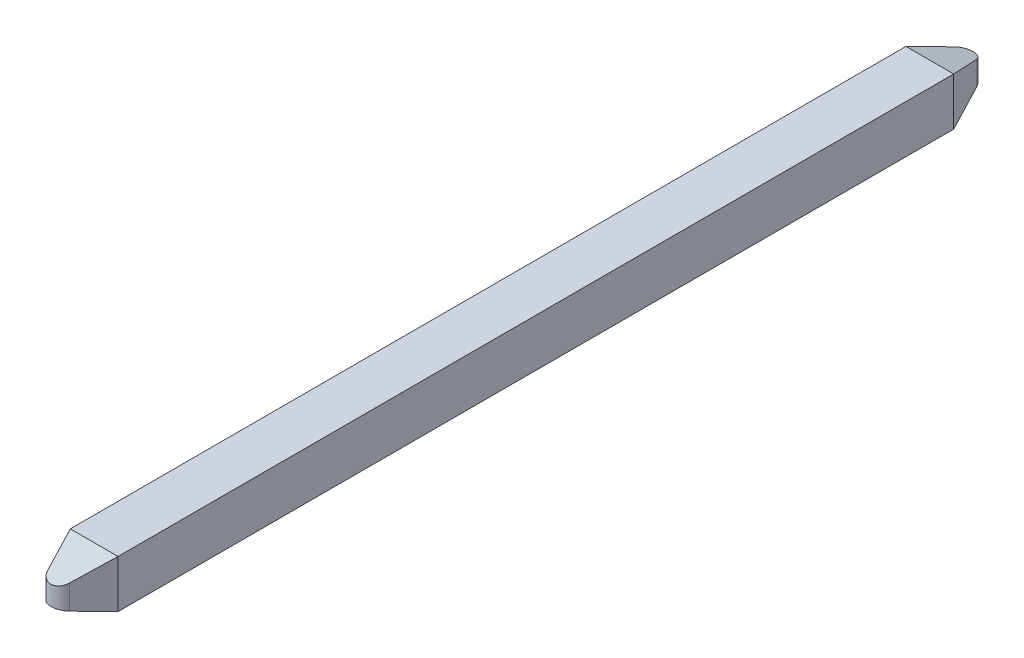
ISO-10303-21;
HEADER;
FILE_DESCRIPTION(('STEP AP214'),'2;1');
FILE_NAME('part.step','',(''),(''),'','','');
FILE_SCHEMA(('AUTOMOTIVE_DESIGN { 1 0 10303 214 1 1 1 1 }'));
ENDSEC;
DATA;
#1=APPLICATION_CONTEXT('core data for automotive mechanical design processes');
#2=APPLICATION_PROTOCOL_DEFINITION('international standard','automotive_design',2000,#1);
#3=PRODUCT_CONTEXT('',#1,'mechanical');
#4=PRODUCT('Part','Part','',(#3));
#5=PRODUCT_RELATED_PRODUCT_CATEGORY('part','',(#4));
#6=PRODUCT_DEFINITION_FORMATION('','',#4);
#7=PRODUCT_DEFINITION_CONTEXT('part definition',#1,'design');
#8=PRODUCT_DEFINITION('design','',#6,#7);
#9=PRODUCT_DEFINITION_SHAPE('','',#8);
#10=(LENGTH_UNIT() NAMED_UNIT(*) SI_UNIT(.MILLI.,.METRE.));
#11=(NAMED_UNIT(*) PLANE_ANGLE_UNIT() SI_UNIT($,.RADIAN.));
#12=(NAMED_UNIT(*) SI_UNIT($,.STERADIAN.) SOLID_ANGLE_UNIT());
#13=UNCERTAINTY_MEASURE_WITH_UNIT(LENGTH_MEASURE(1.E-05),#10,'distance_accuracy_value','');
#14=(GEOMETRIC_REPRESENTATION_CONTEXT(3) GLOBAL_UNCERTAINTY_ASSIGNED_CONTEXT((#13)) GLOBAL_UNIT_ASSIGNED_CONTEXT((#10,
#11,#12)) REPRESENTATION_CONTEXT('',''));
#15=CARTESIAN_POINT('',(0.,0.,0.));
#16=DIRECTION('',(0.,0.,1.));
#17=DIRECTION('',(1.,0.,0.));
#18=AXIS2_PLACEMENT_3D('',#15,#16,#17);
#19=CARTESIAN_POINT('',(-0.1409538931179,-0.31,0.09869697850114));
#20=DIRECTION('',(0.939692620785897,0.,0.342020143325699));
#21=DIRECTION('',(0.342020143325699,0.,-0.939692620785897));
#22=AXIS2_PLACEMENT_3D('',#19,#20,#21);
#23=PLANE('',#22);
#24=DIRECTION('',(-0.32680304383055,-0.294964612550275,0.897883983533593));
#25=VECTOR('',#24,1.);
#26=CARTESIAN_POINT('',(-0.1409538931179,-0.157423026312248,0.0986969785011571));
#27=LINE('',#26,#25);
#28=CARTESIAN_POINT('',(-0.140953893117889,-0.157423026312245,0.0986969785011497));
#29=VERTEX_POINT('',#28);
#30=CARTESIAN_POINT('',(-0.31,-0.31,0.5631473400065));
#31=VERTEX_POINT('',#30);
#32=EDGE_CURVE('E98',#29,#31,#27,.T.);
#33=ORIENTED_EDGE('',*,*,#32,.T.);
#34=DIRECTION('',(0.,1.,0.));
#35=VECTOR('',#34,1.);
#36=CARTESIAN_POINT('',(-0.31,-0.31,0.5631473400065));
#37=LINE('',#36,#35);
#38=CARTESIAN_POINT('',(-0.31,0.310000000000006,0.563147340006498));
#39=VERTEX_POINT('',#38);
#40=EDGE_CURVE('E134',#31,#39,#37,.T.);
#41=ORIENTED_EDGE('',*,*,#40,.T.);
#42=DIRECTION('',(0.32680304383055,-0.294964612550275,-0.897883983533593));
#43=VECTOR('',#42,1.);
#44=CARTESIAN_POINT('',(-0.31,0.310000000000025,0.563147340006492));
#45=LINE('',#44,#43);
#46=CARTESIAN_POINT('',(-0.14095389311789,0.157423026312273,0.0986969785011495));
#47=VERTEX_POINT('',#46);
#48=EDGE_CURVE('E133',#39,#47,#45,.T.);
#49=ORIENTED_EDGE('',*,*,#48,.T.);
#50=DIRECTION('',(0.,-1.,0.));
#51=VECTOR('',#50,1.);
#52=CARTESIAN_POINT('',(-0.140953893117885,-0.31,0.0986969785011456));
#53=LINE('',#52,#51);
#54=EDGE_CURVE('E99',#29,#47,#53,.F.);
#55=ORIENTED_EDGE('',*,*,#54,.F.);
#56=EDGE_LOOP('',(#33,#41,#49,#55));
#57=FACE_BOUND('',#56,.T.);
#58=ADVANCED_FACE('F17',(#57),#23,.F.);
#59=CARTESIAN_POINT('',(-0.31,-0.31,11.40685265999));
#60=DIRECTION('',(0.939692620785897,0.,-0.342020143325699));
#61=DIRECTION('',(-0.342020143325699,0.,-0.939692620785897));
#62=AXIS2_PLACEMENT_3D('',#59,#60,#61);
#63=PLANE('',#62);
#64=DIRECTION('',(-0.326803043827917,0.29496461255056,-0.897883983534458));
#65=VECTOR('',#64,1.);
#66=CARTESIAN_POINT('',(-0.1409538931179,0.157423026310872,11.8713030214995));
#67=LINE('',#66,#65);
#68=CARTESIAN_POINT('',(-0.140953893117836,0.157423026310984,11.8713030214992));
#69=VERTEX_POINT('',#68);
#70=CARTESIAN_POINT('',(-0.31,0.31,11.40685265999));
#71=VERTEX_POINT('',#70);
#72=EDGE_CURVE('E128',#69,#71,#67,.T.);
#73=ORIENTED_EDGE('',*,*,#72,.T.);
#74=DIRECTION('',(0.,1.,0.));
#75=VECTOR('',#74,1.);
#76=CARTESIAN_POINT('',(-0.31,-0.31,11.40685265999));
#77=LINE('',#76,#75);
#78=CARTESIAN_POINT('',(-0.31,-0.310000000000265,11.4068526599901));
#79=VERTEX_POINT('',#78);
#80=EDGE_CURVE('E132',#71,#79,#77,.F.);
#81=ORIENTED_EDGE('',*,*,#80,.T.);
#82=DIRECTION('',(0.326803043827918,0.29496461255056,0.897883983534458));
#83=VECTOR('',#82,1.);
#84=CARTESIAN_POINT('',(-0.31,-0.310000000001059,11.4068526599903));
#85=LINE('',#84,#83);
#86=CARTESIAN_POINT('',(-0.140953893117863,-0.157423026312151,11.8713030214992));
#87=VERTEX_POINT('',#86);
#88=EDGE_CURVE('E177',#79,#87,#85,.T.);
#89=ORIENTED_EDGE('',*,*,#88,.T.);
#90=DIRECTION('',(0.,-1.,0.));
#91=VECTOR('',#90,1.);
#92=CARTESIAN_POINT('',(-0.140953893117519,-0.31,11.8713030214999));
#93=LINE('',#92,#91);
#94=EDGE_CURVE('E131',#69,#87,#93,.T.);
#95=ORIENTED_EDGE('',*,*,#94,.F.);
#96=EDGE_LOOP('',(#73,#81,#89,#95));
#97=FACE_BOUND('',#96,.T.);
#98=ADVANCED_FACE('F204',(#97),#63,.F.);
#99=CARTESIAN_POINT('',(0.,-0.31,0.15));
#100=DIRECTION('',(0.,-1.,0.));
#101=DIRECTION('',(0.,0.,-1.));
#102=AXIS2_PLACEMENT_3D('',#99,#100,#101);
#103=CYLINDRICAL_SURFACE('',#102,0.15);
#104=ORIENTED_EDGE('',*,*,#54,.T.);
#105=CARTESIAN_POINT('',(0.,0.17427662447928,0.15));
#106=DIRECTION('',(0.,-0.950048820835425,0.312101326541908));
#107=DIRECTION('',(0.,-0.312101326541908,-0.950048820835425));
#108=AXIS2_PLACEMENT_3D('',#105,#106,#107);
#109=ELLIPSE('',#108,0.157886622992803,0.15);
#110=CARTESIAN_POINT('',(0.140953893117872,0.157423026312286,0.0986969785011491));
#111=VERTEX_POINT('',#110);
#112=EDGE_CURVE('E86',#47,#111,#109,.T.);
#113=ORIENTED_EDGE('',*,*,#112,.T.);
#114=DIRECTION('',(0.,1.,0.));
#115=VECTOR('',#114,1.);
#116=CARTESIAN_POINT('',(0.14095389311786,-0.31,0.0986969785011545));
#117=LINE('',#116,#115);
#118=CARTESIAN_POINT('',(0.140953893117872,-0.157423026312272,0.098696978501149));
#119=VERTEX_POINT('',#118);
#120=EDGE_CURVE('E80',#111,#119,#117,.F.);
#121=ORIENTED_EDGE('',*,*,#120,.T.);
#122=CARTESIAN_POINT('',(0.,-0.174276624479253,0.15));
#123=DIRECTION('',(0.,0.950048820835425,0.312101326541908));
#124=DIRECTION('',(0.,-0.312101326541908,0.950048820835425));
#125=AXIS2_PLACEMENT_3D('',#122,#123,#124);
#126=ELLIPSE('',#125,0.157886622992803,0.15);
#127=EDGE_CURVE('E20',#119,#29,#126,.T.);
#128=ORIENTED_EDGE('',*,*,#127,.T.);
#129=EDGE_LOOP('',(#104,#113,#121,#128));
#130=FACE_BOUND('',#129,.T.);
#131=ADVANCED_FACE('F83',(#130),#103,.T.);
#132=CARTESIAN_POINT('',(-0.31,-0.31,0.5631473400065));
#133=DIRECTION('',(0.,0.950048820835425,0.312101326541908));
#134=DIRECTION('',(0.,-0.312101326541908,0.950048820835425));
#135=AXIS2_PLACEMENT_3D('',#132,#133,#134);
#136=PLANE('',#135);
#137=ORIENTED_EDGE('',*,*,#32,.F.);
#138=ORIENTED_EDGE('',*,*,#127,.F.);
#139=DIRECTION('',(0.326803043830627,-0.294964612550175,0.897883983533598));
#140=VECTOR('',#139,1.);
#141=CARTESIAN_POINT('',(0.14095389311786,-0.1574230263123,0.0986969785011545));
#142=LINE('',#141,#140);
#143=CARTESIAN_POINT('',(0.31,-0.31,0.5631473400065));
#144=VERTEX_POINT('',#143);
#145=EDGE_CURVE('E91',#119,#144,#142,.T.);
#146=ORIENTED_EDGE('',*,*,#145,.T.);
#147=DIRECTION('',(1.,0.,0.));
#148=VECTOR('',#147,1.);
#149=CARTESIAN_POINT('',(0.,-0.31,0.5631473400065));
#150=LINE('',#149,#148);
#151=EDGE_CURVE('E114',#144,#31,#150,.F.);
#152=ORIENTED_EDGE('',*,*,#151,.T.);
#153=EDGE_LOOP('',(#137,#138,#146,#152));
#154=FACE_BOUND('',#153,.T.);
#155=ADVANCED_FACE('F95',(#154),#136,.F.);
#156=CARTESIAN_POINT('',(-0.31,0.125,0.));
#157=DIRECTION('',(0.,-0.950048820835425,0.312101326541908));
#158=DIRECTION('',(0.,-0.312101326541908,-0.950048820835425));
#159=AXIS2_PLACEMENT_3D('',#156,#157,#158);
#160=PLANE('',#159);
#161=ORIENTED_EDGE('',*,*,#48,.F.);
#162=DIRECTION('',(1.,0.,0.));
#163=VECTOR('',#162,1.);
#164=CARTESIAN_POINT('',(0.,0.31,0.5631473400065));
#165=LINE('',#164,#163);
#166=CARTESIAN_POINT('',(0.31,0.310000000000002,0.5631473400065));
#167=VERTEX_POINT('',#166);
#168=EDGE_CURVE('E105',#167,#39,#165,.F.);
#169=ORIENTED_EDGE('',*,*,#168,.F.);
#170=DIRECTION('',(-0.326803043830627,-0.294964612550175,-0.897883983533598));
#171=VECTOR('',#170,1.);
#172=CARTESIAN_POINT('',(0.31,0.31,0.5631473400065));
#173=LINE('',#172,#171);
#174=EDGE_CURVE('E92',#167,#111,#173,.T.);
#175=ORIENTED_EDGE('',*,*,#174,.T.);
#176=ORIENTED_EDGE('',*,*,#112,.F.);
#177=EDGE_LOOP('',(#161,#169,#175,#176));
#178=FACE_BOUND('',#177,.T.);
#179=ADVANCED_FACE('F216',(#178),#160,.F.);
#180=CARTESIAN_POINT('',(-0.31,-0.31,0.));
#181=DIRECTION('',(1.,0.,0.));
#182=DIRECTION('',(0.,0.,-1.));
#183=AXIS2_PLACEMENT_3D('',#180,#181,#182);
#184=PLANE('',#183);
#185=ORIENTED_EDGE('',*,*,#40,.F.);
#186=DIRECTION('',(0.,0.,1.));
#187=VECTOR('',#186,1.);
#188=CARTESIAN_POINT('',(-0.31,-0.31,5.985));
#189=LINE('',#188,#187);
#190=EDGE_CURVE('E116',#31,#79,#189,.T.);
#191=ORIENTED_EDGE('',*,*,#190,.T.);
#192=ORIENTED_EDGE('',*,*,#80,.F.);
#193=DIRECTION('',(0.,0.,1.));
#194=VECTOR('',#193,1.);
#195=CARTESIAN_POINT('',(-0.31,0.31,5.985));
#196=LINE('',#195,#194);
#197=EDGE_CURVE('E108',#39,#71,#196,.T.);
#198=ORIENTED_EDGE('',*,*,#197,.F.);
#199=EDGE_LOOP('',(#185,#191,#192,#198));
#200=FACE_BOUND('',#199,.T.);
#201=ADVANCED_FACE('F207',(#200),#184,.F.);
#202=CARTESIAN_POINT('',(-0.31,-0.125,11.97));
#203=DIRECTION('',(0.,0.950048820835425,-0.312101326541908));
#204=DIRECTION('',(0.,0.312101326541908,0.950048820835425));
#205=AXIS2_PLACEMENT_3D('',#202,#203,#204);
#206=PLANE('',#205);
#207=DIRECTION('',(-0.326803043830878,0.294964612547799,0.897883983534287));
#208=VECTOR('',#207,1.);
#209=CARTESIAN_POINT('',(0.310000000001532,-0.31,11.4068526599906));
#210=LINE('',#209,#208);
#211=CARTESIAN_POINT('',(0.310000000000574,-0.31,11.4068526599902));
#212=VERTEX_POINT('',#211);
#213=CARTESIAN_POINT('',(0.140953893117885,-0.157423026312073,11.8713030214994));
#214=VERTEX_POINT('',#213);
#215=EDGE_CURVE('E188',#212,#214,#210,.T.);
#216=ORIENTED_EDGE('',*,*,#215,.T.);
#217=CARTESIAN_POINT('',(0.,-0.174276624479276,11.82));
#218=DIRECTION('',(0.,0.950048820835425,-0.312101326541908));
#219=DIRECTION('',(0.,-0.312101326541908,-0.950048820835425));
#220=AXIS2_PLACEMENT_3D('',#217,#218,#219);
#221=ELLIPSE('',#220,0.157886622992803,0.15);
#222=EDGE_CURVE('E129',#87,#214,#221,.T.);
#223=ORIENTED_EDGE('',*,*,#222,.F.);
#224=ORIENTED_EDGE('',*,*,#88,.F.);
#225=DIRECTION('',(1.,0.,0.));
#226=VECTOR('',#225,1.);
#227=CARTESIAN_POINT('',(0.,-0.31,11.40685265999));
#228=LINE('',#227,#226);
#229=EDGE_CURVE('E117',#79,#212,#228,.T.);
#230=ORIENTED_EDGE('',*,*,#229,.T.);
#231=EDGE_LOOP('',(#216,#223,#224,#230));
#232=FACE_BOUND('',#231,.T.);
#233=ADVANCED_FACE('F224',(#232),#206,.F.);
#234=CARTESIAN_POINT('',(0.,-0.31,11.82));
#235=DIRECTION('',(0.,-1.,0.));
#236=DIRECTION('',(0.,0.,-1.));
#237=AXIS2_PLACEMENT_3D('',#234,#235,#236);
#238=CYLINDRICAL_SURFACE('',#237,0.15);
#239=ORIENTED_EDGE('',*,*,#94,.T.);
#240=ORIENTED_EDGE('',*,*,#222,.T.);
#241=DIRECTION('',(0.,1.,0.));
#242=VECTOR('',#241,1.);
#243=CARTESIAN_POINT('',(0.1409538931179,-0.31,11.8713030215));
#244=LINE('',#243,#242);
#245=CARTESIAN_POINT('',(0.140953893117885,0.15742302631169,11.8713030214994));
#246=VERTEX_POINT('',#245);
#247=EDGE_CURVE('E158',#214,#246,#244,.T.);
#248=ORIENTED_EDGE('',*,*,#247,.T.);
#249=CARTESIAN_POINT('',(0.,0.174276624478102,11.82));
#250=DIRECTION('',(0.,-0.950048820835425,-0.312101326541908));
#251=DIRECTION('',(0.,-0.312101326541908,0.950048820835425));
#252=AXIS2_PLACEMENT_3D('',#249,#250,#251);
#253=ELLIPSE('',#252,0.157886622992803,0.15);
#254=EDGE_CURVE('E125',#246,#69,#253,.T.);
#255=ORIENTED_EDGE('',*,*,#254,.T.);
#256=EDGE_LOOP('',(#239,#240,#248,#255));
#257=FACE_BOUND('',#256,.T.);
#258=ADVANCED_FACE('F247',(#257),#238,.T.);
#259=CARTESIAN_POINT('',(-0.31,0.31,11.40685265999));
#260=DIRECTION('',(0.,-0.950048820835425,-0.312101326541908));
#261=DIRECTION('',(0.,0.312101326541908,-0.950048820835425));
#262=AXIS2_PLACEMENT_3D('',#259,#260,#261);
#263=PLANE('',#262);
#264=DIRECTION('',(0.326803043830878,0.294964612547799,-0.897883983534287));
#265=VECTOR('',#264,1.);
#266=CARTESIAN_POINT('',(0.1409538931179,0.1574230263123,11.8713030215));
#267=LINE('',#266,#265);
#268=CARTESIAN_POINT('',(0.310000000000766,0.31,11.4068526599903));
#269=VERTEX_POINT('',#268);
#270=EDGE_CURVE('E35',#246,#269,#267,.T.);
#271=ORIENTED_EDGE('',*,*,#270,.T.);
#272=DIRECTION('',(1.,0.,0.));
#273=VECTOR('',#272,1.);
#274=CARTESIAN_POINT('',(0.,0.31,11.40685265999));
#275=LINE('',#274,#273);
#276=EDGE_CURVE('E171',#71,#269,#275,.T.);
#277=ORIENTED_EDGE('',*,*,#276,.F.);
#278=ORIENTED_EDGE('',*,*,#72,.F.);
#279=ORIENTED_EDGE('',*,*,#254,.F.);
#280=EDGE_LOOP('',(#271,#277,#278,#279));
#281=FACE_BOUND('',#280,.T.);
#282=ADVANCED_FACE('F210',(#281),#263,.F.);
#283=CARTESIAN_POINT('',(0.,-0.31,5.985));
#284=DIRECTION('',(0.,1.,0.));
#285=DIRECTION('',(0.,0.,1.));
#286=AXIS2_PLACEMENT_3D('',#283,#284,#285);
#287=PLANE('',#286);
#288=ORIENTED_EDGE('',*,*,#151,.F.);
#289=DIRECTION('',(0.,0.,-1.));
#290=VECTOR('',#289,1.);
#291=CARTESIAN_POINT('',(0.31,-0.31,0.));
#292=LINE('',#291,#290);
#293=EDGE_CURVE('E150',#212,#144,#292,.T.);
#294=ORIENTED_EDGE('',*,*,#293,.F.);
#295=ORIENTED_EDGE('',*,*,#229,.F.);
#296=ORIENTED_EDGE('',*,*,#190,.F.);
#297=EDGE_LOOP('',(#288,#294,#295,#296));
#298=FACE_BOUND('',#297,.T.);
#299=ADVANCED_FACE('F241',(#298),#287,.F.);
#300=CARTESIAN_POINT('',(0.31,-0.31,0.5631473400065));
#301=DIRECTION('',(-0.939692620785897,0.,0.342020143325699));
#302=DIRECTION('',(0.342020143325699,0.,0.939692620785897));
#303=AXIS2_PLACEMENT_3D('',#300,#301,#302);
#304=PLANE('',#303);
#305=ORIENTED_EDGE('',*,*,#145,.F.);
#306=ORIENTED_EDGE('',*,*,#120,.F.);
#307=ORIENTED_EDGE('',*,*,#174,.F.);
#308=DIRECTION('',(0.,1.,0.));
#309=VECTOR('',#308,1.);
#310=CARTESIAN_POINT('',(0.31,-0.31,0.5631473400065));
#311=LINE('',#310,#309);
#312=EDGE_CURVE('E103',#144,#167,#311,.T.);
#313=ORIENTED_EDGE('',*,*,#312,.F.);
#314=EDGE_LOOP('',(#305,#306,#307,#313));
#315=FACE_BOUND('',#314,.T.);
#316=ADVANCED_FACE('F101',(#315),#304,.F.);
#317=CARTESIAN_POINT('',(0.,0.31,5.985));
#318=DIRECTION('',(0.,1.,0.));
#319=DIRECTION('',(0.,0.,1.));
#320=AXIS2_PLACEMENT_3D('',#317,#318,#319);
#321=PLANE('',#320);
#322=ORIENTED_EDGE('',*,*,#197,.T.);
#323=ORIENTED_EDGE('',*,*,#276,.T.);
#324=DIRECTION('',(0.,0.,-1.));
#325=VECTOR('',#324,1.);
#326=CARTESIAN_POINT('',(0.31,0.31,0.));
#327=LINE('',#326,#325);
#328=EDGE_CURVE('E26',#167,#269,#327,.F.);
#329=ORIENTED_EDGE('',*,*,#328,.F.);
#330=ORIENTED_EDGE('',*,*,#168,.T.);
#331=EDGE_LOOP('',(#322,#323,#329,#330));
#332=FACE_BOUND('',#331,.T.);
#333=ADVANCED_FACE('F214',(#332),#321,.T.);
#334=CARTESIAN_POINT('',(0.1409538931179,-0.31,11.8713030215));
#335=DIRECTION('',(-0.939692620785897,0.,-0.342020143325699));
#336=DIRECTION('',(-0.342020143325699,0.,0.939692620785897));
#337=AXIS2_PLACEMENT_3D('',#334,#335,#336);
#338=PLANE('',#337);
#339=ORIENTED_EDGE('',*,*,#270,.F.);
#340=ORIENTED_EDGE('',*,*,#247,.F.);
#341=ORIENTED_EDGE('',*,*,#215,.F.);
#342=DIRECTION('',(0.,1.,0.));
#343=VECTOR('',#342,1.);
#344=CARTESIAN_POINT('',(0.31,-0.31,11.40685265999));
#345=LINE('',#344,#343);
#346=EDGE_CURVE('E11',#269,#212,#345,.F.);
#347=ORIENTED_EDGE('',*,*,#346,.F.);
#348=EDGE_LOOP('',(#339,#340,#341,#347));
#349=FACE_BOUND('',#348,.T.);
#350=ADVANCED_FACE('F229',(#349),#338,.F.);
#351=CARTESIAN_POINT('',(0.31,-0.31,0.));
#352=DIRECTION('',(1.,0.,0.));
#353=DIRECTION('',(0.,0.,-1.));
#354=AXIS2_PLACEMENT_3D('',#351,#352,#353);
#355=PLANE('',#354);
#356=ORIENTED_EDGE('',*,*,#328,.T.);
#357=ORIENTED_EDGE('',*,*,#346,.T.);
#358=ORIENTED_EDGE('',*,*,#293,.T.);
#359=ORIENTED_EDGE('',*,*,#312,.T.);
#360=EDGE_LOOP('',(#356,#357,#358,#359));
#361=FACE_BOUND('',#360,.T.);
#362=ADVANCED_FACE('F227',(#361),#355,.T.);
#363=CLOSED_SHELL('',(#58,#98,#131,#155,#179,#201,#233,#258,#282,#299,#316,#333,#350,#362));
#364=MANIFOLD_SOLID_BREP('B1',#363);
#365=ADVANCED_BREP_SHAPE_REPRESENTATION('',(#18,#364),#14);
#366=SHAPE_DEFINITION_REPRESENTATION(#9,#365);
ENDSEC;
END-ISO-10303-21;
